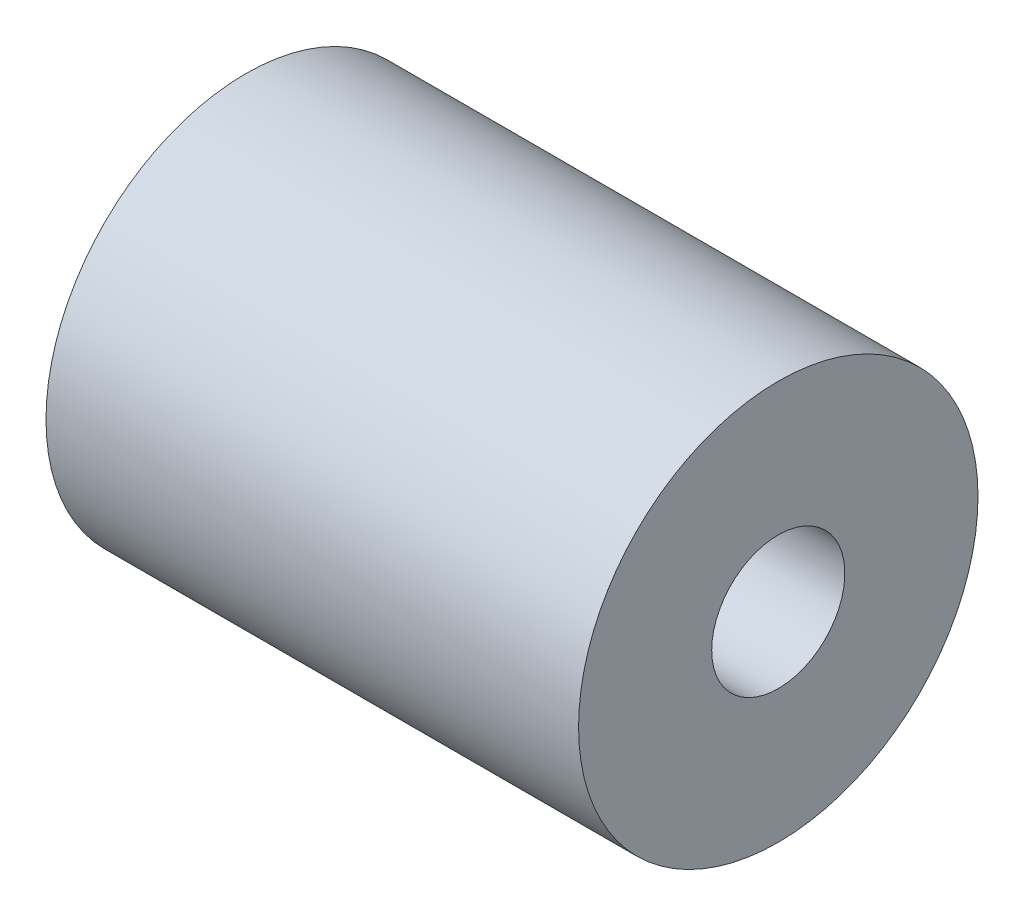
ISO-10303-21;
HEADER;
FILE_DESCRIPTION(('STEP AP214'),'2;1');
FILE_NAME('part.step','',(''),(''),'','','');
FILE_SCHEMA(('AUTOMOTIVE_DESIGN { 1 0 10303 214 1 1 1 1 }'));
ENDSEC;
DATA;
#1=APPLICATION_CONTEXT('core data for automotive mechanical design processes');
#2=APPLICATION_PROTOCOL_DEFINITION('international standard','automotive_design',2000,#1);
#3=PRODUCT_CONTEXT('',#1,'mechanical');
#4=PRODUCT('Part','Part','',(#3));
#5=PRODUCT_RELATED_PRODUCT_CATEGORY('part','',(#4));
#6=PRODUCT_DEFINITION_FORMATION('','',#4);
#7=PRODUCT_DEFINITION_CONTEXT('part definition',#1,'design');
#8=PRODUCT_DEFINITION('design','',#6,#7);
#9=PRODUCT_DEFINITION_SHAPE('','',#8);
#10=(LENGTH_UNIT() NAMED_UNIT(*) SI_UNIT(.MILLI.,.METRE.));
#11=(NAMED_UNIT(*) PLANE_ANGLE_UNIT() SI_UNIT($,.RADIAN.));
#12=(NAMED_UNIT(*) SI_UNIT($,.STERADIAN.) SOLID_ANGLE_UNIT());
#13=UNCERTAINTY_MEASURE_WITH_UNIT(LENGTH_MEASURE(1.E-05),#10,'distance_accuracy_value','');
#14=(GEOMETRIC_REPRESENTATION_CONTEXT(3) GLOBAL_UNCERTAINTY_ASSIGNED_CONTEXT((#13)) GLOBAL_UNIT_ASSIGNED_CONTEXT((#10,
#11,#12)) REPRESENTATION_CONTEXT('',''));
#15=CARTESIAN_POINT('',(0.,0.,0.));
#16=DIRECTION('',(0.,0.,1.));
#17=DIRECTION('',(1.,0.,0.));
#18=AXIS2_PLACEMENT_3D('',#15,#16,#17);
#19=CARTESIAN_POINT('',(25.4,0.,0.));
#20=DIRECTION('',(1.,0.,0.));
#21=DIRECTION('',(0.,0.,-1.));
#22=AXIS2_PLACEMENT_3D('',#19,#20,#21);
#23=PLANE('',#22);
#24=CARTESIAN_POINT('',(25.4,0.,0.));
#25=DIRECTION('',(1.,0.,0.));
#26=DIRECTION('',(0.,0.,-1.));
#27=AXIS2_PLACEMENT_3D('',#24,#25,#26);
#28=CIRCLE('',#27,9.525);
#29=CARTESIAN_POINT('',(25.4,0.,9.525));
#30=VERTEX_POINT('',#29);
#31=EDGE_CURVE('E10',#30,#30,#28,.T.);
#32=ORIENTED_EDGE('',*,*,#31,.T.);
#33=EDGE_LOOP('',(#32));
#34=FACE_BOUND('',#33,.T.);
#35=CARTESIAN_POINT('',(25.4,0.,0.));
#36=DIRECTION('',(1.,0.,0.));
#37=DIRECTION('',(0.,0.,-1.));
#38=AXIS2_PLACEMENT_3D('',#35,#36,#37);
#39=CIRCLE('',#38,3.175);
#40=CARTESIAN_POINT('',(25.4,0.,3.175));
#41=VERTEX_POINT('',#40);
#42=EDGE_CURVE('E41',#41,#41,#39,.T.);
#43=ORIENTED_EDGE('',*,*,#42,.F.);
#44=EDGE_LOOP('',(#43));
#45=FACE_BOUND('',#44,.T.);
#46=ADVANCED_FACE('F30',(#34,#45),#23,.T.);
#47=CARTESIAN_POINT('',(0.,0.,0.));
#48=DIRECTION('',(1.,0.,0.));
#49=DIRECTION('',(0.,0.,-1.));
#50=AXIS2_PLACEMENT_3D('',#47,#48,#49);
#51=PLANE('',#50);
#52=CARTESIAN_POINT('',(0.,0.,0.));
#53=DIRECTION('',(1.,0.,0.));
#54=DIRECTION('',(0.,0.,-1.));
#55=AXIS2_PLACEMENT_3D('',#52,#53,#54);
#56=CIRCLE('',#55,9.525);
#57=CARTESIAN_POINT('',(0.,0.,9.525));
#58=VERTEX_POINT('',#57);
#59=EDGE_CURVE('E34',#58,#58,#56,.T.);
#60=ORIENTED_EDGE('',*,*,#59,.F.);
#61=EDGE_LOOP('',(#60));
#62=FACE_BOUND('',#61,.T.);
#63=CARTESIAN_POINT('',(0.,0.,0.));
#64=DIRECTION('',(1.,0.,0.));
#65=DIRECTION('',(0.,0.,-1.));
#66=AXIS2_PLACEMENT_3D('',#63,#64,#65);
#67=CIRCLE('',#66,3.175);
#68=CARTESIAN_POINT('',(0.,0.,3.175));
#69=VERTEX_POINT('',#68);
#70=EDGE_CURVE('E43',#69,#69,#67,.T.);
#71=ORIENTED_EDGE('',*,*,#70,.T.);
#72=EDGE_LOOP('',(#71));
#73=FACE_BOUND('',#72,.T.);
#74=ADVANCED_FACE('F53',(#62,#73),#51,.F.);
#75=CARTESIAN_POINT('',(25.4,0.,0.));
#76=DIRECTION('',(-1.,0.,0.));
#77=DIRECTION('',(0.,0.,1.));
#78=AXIS2_PLACEMENT_3D('',#75,#76,#77);
#79=CYLINDRICAL_SURFACE('',#78,9.525);
#80=CARTESIAN_POINT('',(25.4,0.,9.525));
#81=CARTESIAN_POINT('',(25.1354166666667,0.,9.525));
#82=CARTESIAN_POINT('',(24.8708333333333,0.,9.525));
#83=CARTESIAN_POINT('',(24.3416666666667,0.,9.525));
#84=CARTESIAN_POINT('',(24.0770833333333,0.,9.525));
#85=CARTESIAN_POINT('',(23.5479166666667,0.,9.525));
#86=CARTESIAN_POINT('',(23.2833333333333,0.,9.525));
#87=CARTESIAN_POINT('',(22.7541666666667,0.,9.525));
#88=CARTESIAN_POINT('',(22.4895833333333,0.,9.525));
#89=CARTESIAN_POINT('',(21.9604166666667,0.,9.525));
#90=CARTESIAN_POINT('',(21.6958333333333,0.,9.525));
#91=CARTESIAN_POINT('',(21.1666666666667,0.,9.525));
#92=CARTESIAN_POINT('',(20.9020833333333,0.,9.525));
#93=CARTESIAN_POINT('',(20.3729166666667,0.,9.525));
#94=CARTESIAN_POINT('',(20.1083333333333,0.,9.525));
#95=CARTESIAN_POINT('',(19.5791666666667,0.,9.525));
#96=CARTESIAN_POINT('',(19.3145833333333,0.,9.525));
#97=CARTESIAN_POINT('',(18.7854166666667,0.,9.525));
#98=CARTESIAN_POINT('',(18.5208333333333,0.,9.525));
#99=CARTESIAN_POINT('',(17.9916666666667,0.,9.525));
#100=CARTESIAN_POINT('',(17.7270833333333,0.,9.525));
#101=CARTESIAN_POINT('',(17.1979166666667,0.,9.525));
#102=CARTESIAN_POINT('',(16.9333333333333,0.,9.525));
#103=CARTESIAN_POINT('',(16.4041666666667,0.,9.525));
#104=CARTESIAN_POINT('',(16.1395833333333,0.,9.525));
#105=CARTESIAN_POINT('',(15.6104166666667,0.,9.525));
#106=CARTESIAN_POINT('',(15.3458333333333,0.,9.525));
#107=CARTESIAN_POINT('',(14.8166666666667,0.,9.525));
#108=CARTESIAN_POINT('',(14.5520833333333,0.,9.525));
#109=CARTESIAN_POINT('',(14.0229166666667,0.,9.525));
#110=CARTESIAN_POINT('',(13.7583333333333,0.,9.525));
#111=CARTESIAN_POINT('',(13.2291666666667,0.,9.525));
#112=CARTESIAN_POINT('',(12.9645833333333,0.,9.525));
#113=CARTESIAN_POINT('',(12.4354166666667,0.,9.525));
#114=CARTESIAN_POINT('',(12.1708333333333,0.,9.525));
#115=CARTESIAN_POINT('',(11.6416666666667,0.,9.525));
#116=CARTESIAN_POINT('',(11.3770833333333,0.,9.525));
#117=CARTESIAN_POINT('',(10.8479166666667,0.,9.525));
#118=CARTESIAN_POINT('',(10.5833333333333,0.,9.525));
#119=CARTESIAN_POINT('',(10.0541666666667,0.,9.525));
#120=CARTESIAN_POINT('',(9.78958333333333,0.,9.525));
#121=CARTESIAN_POINT('',(9.26041666666667,0.,9.525));
#122=CARTESIAN_POINT('',(8.99583333333334,0.,9.525));
#123=CARTESIAN_POINT('',(8.46666666666667,0.,9.525));
#124=CARTESIAN_POINT('',(8.20208333333333,0.,9.525));
#125=CARTESIAN_POINT('',(7.67291666666667,0.,9.525));
#126=CARTESIAN_POINT('',(7.40833333333333,0.,9.525));
#127=CARTESIAN_POINT('',(6.87916666666667,0.,9.525));
#128=CARTESIAN_POINT('',(6.61458333333333,0.,9.525));
#129=CARTESIAN_POINT('',(6.08541666666667,0.,9.525));
#130=CARTESIAN_POINT('',(5.82083333333333,0.,9.525));
#131=CARTESIAN_POINT('',(5.29166666666667,0.,9.525));
#132=CARTESIAN_POINT('',(5.02708333333334,0.,9.525));
#133=CARTESIAN_POINT('',(4.49791666666667,0.,9.525));
#134=CARTESIAN_POINT('',(4.23333333333333,0.,9.525));
#135=CARTESIAN_POINT('',(3.70416666666667,0.,9.525));
#136=CARTESIAN_POINT('',(3.43958333333333,0.,9.525));
#137=CARTESIAN_POINT('',(2.91041666666667,0.,9.525));
#138=CARTESIAN_POINT('',(2.64583333333333,0.,9.525));
#139=CARTESIAN_POINT('',(2.11666666666667,0.,9.525));
#140=CARTESIAN_POINT('',(1.85208333333333,0.,9.525));
#141=CARTESIAN_POINT('',(1.32291666666667,0.,9.525));
#142=CARTESIAN_POINT('',(1.05833333333333,0.,9.525));
#143=CARTESIAN_POINT('',(0.529166666666666,0.,9.525));
#144=CARTESIAN_POINT('',(0.264583333333333,0.,9.525));
#145=CARTESIAN_POINT('',(0.,0.,9.525));
#146=B_SPLINE_CURVE_WITH_KNOTS('',3,(#80,#81,#82,#83,#84,#85,#86,#87,#88,#89,#90,#91,#92,#93,
#94,#95,#96,#97,#98,#99,#100,#101,#102,#103,#104,#105,#106,#107,#108,#109,#110,#111,#112,#113,
#114,#115,#116,#117,#118,#119,#120,#121,#122,#123,#124,#125,#126,#127,#128,#129,#130,#131,#132,
#133,#134,#135,#136,#137,#138,#139,#140,#141,#142,#143,#144,#145),.UNSPECIFIED.,.F.,.F.,(4,2,2,
2,2,2,2,2,2,2,2,2,2,2,2,2,2,2,2,2,2,2,2,2,2,2,2,2,2,2,2,2,4),(0.,0.793750000000003,1.5875,
2.38125,3.175,3.96875,4.7625,5.55625,6.35,7.14375,7.9375,8.73125,9.525,10.31875,11.1125,
11.90625,12.7,13.49375,14.2875,15.08125,15.875,16.66875,17.4625,18.25625,19.05,19.84375,20.6375,
21.43125,22.225,23.01875,23.8125,24.60625,25.4),.UNSPECIFIED.);
#147=EDGE_CURVE('BSEAM32',#30,#58,#146,.T.);
#148=ORIENTED_EDGE('',*,*,#31,.F.);
#149=ORIENTED_EDGE('',*,*,#59,.T.);
#150=ORIENTED_EDGE('',*,*,#147,.T.);
#151=ORIENTED_EDGE('',*,*,#147,.F.);
#152=EDGE_LOOP('',(#148,#150,#149,#151));
#153=FACE_BOUND('',#152,.T.);
#154=ADVANCED_FACE('F32',(#153),#79,.T.);
#155=CARTESIAN_POINT('',(25.4,0.,0.));
#156=DIRECTION('',(-1.,0.,0.));
#157=DIRECTION('',(0.,0.,1.));
#158=AXIS2_PLACEMENT_3D('',#155,#156,#157);
#159=CYLINDRICAL_SURFACE('',#158,3.175);
#160=CARTESIAN_POINT('',(25.4,0.,3.175));
#161=CARTESIAN_POINT('',(25.1354166666667,0.,3.175));
#162=CARTESIAN_POINT('',(24.8708333333333,0.,3.175));
#163=CARTESIAN_POINT('',(24.3416666666667,0.,3.175));
#164=CARTESIAN_POINT('',(24.0770833333333,0.,3.175));
#165=CARTESIAN_POINT('',(23.5479166666667,0.,3.175));
#166=CARTESIAN_POINT('',(23.2833333333333,0.,3.175));
#167=CARTESIAN_POINT('',(22.7541666666667,0.,3.175));
#168=CARTESIAN_POINT('',(22.4895833333333,0.,3.175));
#169=CARTESIAN_POINT('',(21.9604166666667,0.,3.175));
#170=CARTESIAN_POINT('',(21.6958333333333,0.,3.175));
#171=CARTESIAN_POINT('',(21.1666666666667,0.,3.175));
#172=CARTESIAN_POINT('',(20.9020833333333,0.,3.175));
#173=CARTESIAN_POINT('',(20.3729166666667,0.,3.175));
#174=CARTESIAN_POINT('',(20.1083333333333,0.,3.175));
#175=CARTESIAN_POINT('',(19.5791666666667,0.,3.175));
#176=CARTESIAN_POINT('',(19.3145833333333,0.,3.175));
#177=CARTESIAN_POINT('',(18.7854166666667,0.,3.175));
#178=CARTESIAN_POINT('',(18.5208333333333,0.,3.175));
#179=CARTESIAN_POINT('',(17.9916666666667,0.,3.175));
#180=CARTESIAN_POINT('',(17.7270833333333,0.,3.175));
#181=CARTESIAN_POINT('',(17.1979166666667,0.,3.175));
#182=CARTESIAN_POINT('',(16.9333333333333,0.,3.175));
#183=CARTESIAN_POINT('',(16.4041666666667,0.,3.175));
#184=CARTESIAN_POINT('',(16.1395833333333,0.,3.175));
#185=CARTESIAN_POINT('',(15.6104166666667,0.,3.175));
#186=CARTESIAN_POINT('',(15.3458333333333,0.,3.175));
#187=CARTESIAN_POINT('',(14.8166666666667,0.,3.175));
#188=CARTESIAN_POINT('',(14.5520833333333,0.,3.175));
#189=CARTESIAN_POINT('',(14.0229166666667,0.,3.175));
#190=CARTESIAN_POINT('',(13.7583333333333,0.,3.175));
#191=CARTESIAN_POINT('',(13.2291666666667,0.,3.175));
#192=CARTESIAN_POINT('',(12.9645833333333,0.,3.175));
#193=CARTESIAN_POINT('',(12.4354166666667,0.,3.175));
#194=CARTESIAN_POINT('',(12.1708333333333,0.,3.175));
#195=CARTESIAN_POINT('',(11.6416666666667,0.,3.175));
#196=CARTESIAN_POINT('',(11.3770833333333,0.,3.175));
#197=CARTESIAN_POINT('',(10.8479166666667,0.,3.175));
#198=CARTESIAN_POINT('',(10.5833333333333,0.,3.175));
#199=CARTESIAN_POINT('',(10.0541666666667,0.,3.175));
#200=CARTESIAN_POINT('',(9.78958333333333,0.,3.175));
#201=CARTESIAN_POINT('',(9.26041666666667,0.,3.175));
#202=CARTESIAN_POINT('',(8.99583333333334,0.,3.175));
#203=CARTESIAN_POINT('',(8.46666666666667,0.,3.175));
#204=CARTESIAN_POINT('',(8.20208333333333,0.,3.175));
#205=CARTESIAN_POINT('',(7.67291666666667,0.,3.175));
#206=CARTESIAN_POINT('',(7.40833333333333,0.,3.175));
#207=CARTESIAN_POINT('',(6.87916666666667,0.,3.175));
#208=CARTESIAN_POINT('',(6.61458333333333,0.,3.175));
#209=CARTESIAN_POINT('',(6.08541666666667,0.,3.175));
#210=CARTESIAN_POINT('',(5.82083333333333,0.,3.175));
#211=CARTESIAN_POINT('',(5.29166666666667,0.,3.175));
#212=CARTESIAN_POINT('',(5.02708333333334,0.,3.175));
#213=CARTESIAN_POINT('',(4.49791666666667,0.,3.175));
#214=CARTESIAN_POINT('',(4.23333333333333,0.,3.175));
#215=CARTESIAN_POINT('',(3.70416666666667,0.,3.175));
#216=CARTESIAN_POINT('',(3.43958333333333,0.,3.175));
#217=CARTESIAN_POINT('',(2.91041666666667,0.,3.175));
#218=CARTESIAN_POINT('',(2.64583333333333,0.,3.175));
#219=CARTESIAN_POINT('',(2.11666666666667,0.,3.175));
#220=CARTESIAN_POINT('',(1.85208333333333,0.,3.175));
#221=CARTESIAN_POINT('',(1.32291666666667,0.,3.175));
#222=CARTESIAN_POINT('',(1.05833333333333,0.,3.175));
#223=CARTESIAN_POINT('',(0.529166666666666,0.,3.175));
#224=CARTESIAN_POINT('',(0.264583333333333,0.,3.175));
#225=CARTESIAN_POINT('',(0.,0.,3.175));
#226=B_SPLINE_CURVE_WITH_KNOTS('',3,(#160,#161,#162,#163,#164,#165,#166,#167,#168,#169,#170,
#171,#172,#173,#174,#175,#176,#177,#178,#179,#180,#181,#182,#183,#184,#185,#186,#187,#188,#189,
#190,#191,#192,#193,#194,#195,#196,#197,#198,#199,#200,#201,#202,#203,#204,#205,#206,#207,#208,
#209,#210,#211,#212,#213,#214,#215,#216,#217,#218,#219,#220,#221,#222,#223,#224,#225),
.UNSPECIFIED.,.F.,.F.,(4,2,2,2,2,2,2,2,2,2,2,2,2,2,2,2,2,2,2,2,2,2,2,2,2,2,2,2,2,2,2,2,4),(0.,
0.793750000000003,1.5875,2.38125,3.175,3.96875,4.7625,5.55625,6.35,7.14375,7.9375,8.73125,9.525,
10.31875,11.1125,11.90625,12.7,13.49375,14.2875,15.08125,15.875,16.66875,17.4625,18.25625,19.05,
19.84375,20.6375,21.43125,22.225,23.01875,23.8125,24.60625,25.4),.UNSPECIFIED.);
#227=EDGE_CURVE('BSEAM49',#41,#69,#226,.T.);
#228=ORIENTED_EDGE('',*,*,#42,.T.);
#229=ORIENTED_EDGE('',*,*,#70,.F.);
#230=ORIENTED_EDGE('',*,*,#227,.T.);
#231=ORIENTED_EDGE('',*,*,#227,.F.);
#232=EDGE_LOOP('',(#228,#230,#229,#231));
#233=FACE_BOUND('',#232,.T.);
#234=ADVANCED_FACE('F49',(#233),#159,.F.);
#235=CLOSED_SHELL('',(#46,#74,#154,#234));
#236=MANIFOLD_SOLID_BREP('B2',#235);
#237=ADVANCED_BREP_SHAPE_REPRESENTATION('',(#18,#236),#14);
#238=SHAPE_DEFINITION_REPRESENTATION(#9,#237);
ENDSEC;
END-ISO-10303-21;
